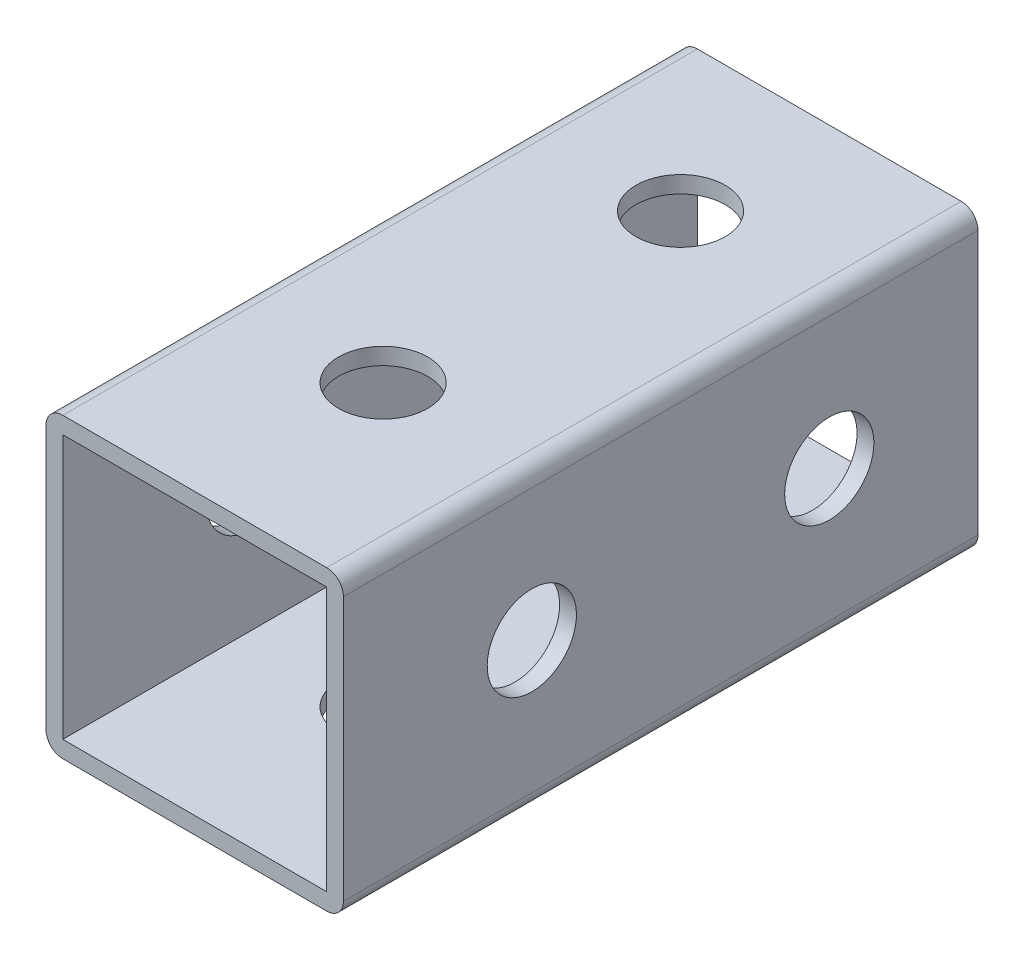
ISO-10303-21;
HEADER;
FILE_DESCRIPTION(('STEP AP214'),'2;1');
FILE_NAME('part.step','',(''),(''),'','','');
FILE_SCHEMA(('AUTOMOTIVE_DESIGN { 1 0 10303 214 1 1 1 1 }'));
ENDSEC;
DATA;
#1=APPLICATION_CONTEXT('core data for automotive mechanical design processes');
#2=APPLICATION_PROTOCOL_DEFINITION('international standard','automotive_design',2000,#1);
#3=PRODUCT_CONTEXT('',#1,'mechanical');
#4=PRODUCT('Part','Part','',(#3));
#5=PRODUCT_RELATED_PRODUCT_CATEGORY('part','',(#4));
#6=PRODUCT_DEFINITION_FORMATION('','',#4);
#7=PRODUCT_DEFINITION_CONTEXT('part definition',#1,'design');
#8=PRODUCT_DEFINITION('design','',#6,#7);
#9=PRODUCT_DEFINITION_SHAPE('','',#8);
#10=(LENGTH_UNIT() NAMED_UNIT(*) SI_UNIT(.MILLI.,.METRE.));
#11=(NAMED_UNIT(*) PLANE_ANGLE_UNIT() SI_UNIT($,.RADIAN.));
#12=(NAMED_UNIT(*) SI_UNIT($,.STERADIAN.) SOLID_ANGLE_UNIT());
#13=UNCERTAINTY_MEASURE_WITH_UNIT(LENGTH_MEASURE(1.E-05),#10,'distance_accuracy_value','');
#14=(GEOMETRIC_REPRESENTATION_CONTEXT(3) GLOBAL_UNCERTAINTY_ASSIGNED_CONTEXT((#13)) GLOBAL_UNIT_ASSIGNED_CONTEXT((#10,
#11,#12)) REPRESENTATION_CONTEXT('',''));
#15=CARTESIAN_POINT('',(0.,0.,0.));
#16=DIRECTION('',(0.,0.,1.));
#17=DIRECTION('',(1.,0.,0.));
#18=AXIS2_PLACEMENT_3D('',#15,#16,#17);
#19=CARTESIAN_POINT('',(21.1201,21.1201,101.6));
#20=DIRECTION('',(0.,0.,-1.));
#21=DIRECTION('',(-1.,0.,0.));
#22=AXIS2_PLACEMENT_3D('',#19,#20,#21);
#23=PLANE('',#22);
#24=CARTESIAN_POINT('',(21.1201,21.1201,101.6));
#25=DIRECTION('',(0.,0.,1.));
#26=DIRECTION('',(-1.,0.,0.));
#27=AXIS2_PLACEMENT_3D('',#24,#25,#26);
#28=CIRCLE('',#27,2.6924);
#29=CARTESIAN_POINT('',(23.8125,21.1201,101.6));
#30=VERTEX_POINT('',#29);
#31=CARTESIAN_POINT('',(21.1201,23.8125,101.6));
#32=VERTEX_POINT('',#31);
#33=EDGE_CURVE('E161',#30,#32,#28,.T.);
#34=ORIENTED_EDGE('',*,*,#33,.T.);
#35=DIRECTION('',(-1.,0.,0.));
#36=VECTOR('',#35,1.);
#37=CARTESIAN_POINT('',(-21.1201,23.8125,101.6));
#38=LINE('',#37,#36);
#39=CARTESIAN_POINT('',(-21.1201,23.8125,101.6));
#40=VERTEX_POINT('',#39);
#41=EDGE_CURVE('E164',#32,#40,#38,.T.);
#42=ORIENTED_EDGE('',*,*,#41,.T.);
#43=CARTESIAN_POINT('',(-21.1201,21.1201,101.6));
#44=DIRECTION('',(0.,0.,1.));
#45=DIRECTION('',(1.,0.,0.));
#46=AXIS2_PLACEMENT_3D('',#43,#44,#45);
#47=CIRCLE('',#46,2.69240000000001);
#48=CARTESIAN_POINT('',(-23.8125,21.1201,101.6));
#49=VERTEX_POINT('',#48);
#50=EDGE_CURVE('E167',#40,#49,#47,.T.);
#51=ORIENTED_EDGE('',*,*,#50,.T.);
#52=DIRECTION('',(0.,-1.,0.));
#53=VECTOR('',#52,1.);
#54=CARTESIAN_POINT('',(-23.8125,21.1201,101.6));
#55=LINE('',#54,#53);
#56=CARTESIAN_POINT('',(-23.8125,-21.1201,101.6));
#57=VERTEX_POINT('',#56);
#58=EDGE_CURVE('E169',#49,#57,#55,.T.);
#59=ORIENTED_EDGE('',*,*,#58,.T.);
#60=CARTESIAN_POINT('',(-21.1201,-21.1201,101.6));
#61=DIRECTION('',(0.,0.,1.));
#62=DIRECTION('',(-1.,0.,0.));
#63=AXIS2_PLACEMENT_3D('',#60,#61,#62);
#64=CIRCLE('',#63,2.69240000000001);
#65=CARTESIAN_POINT('',(-21.1201,-23.8125,101.6));
#66=VERTEX_POINT('',#65);
#67=EDGE_CURVE('E171',#57,#66,#64,.T.);
#68=ORIENTED_EDGE('',*,*,#67,.T.);
#69=DIRECTION('',(1.,0.,0.));
#70=VECTOR('',#69,1.);
#71=CARTESIAN_POINT('',(-21.1201,-23.8125,101.6));
#72=LINE('',#71,#70);
#73=CARTESIAN_POINT('',(21.1201,-23.8125,101.6));
#74=VERTEX_POINT('',#73);
#75=EDGE_CURVE('E173',#66,#74,#72,.T.);
#76=ORIENTED_EDGE('',*,*,#75,.T.);
#77=CARTESIAN_POINT('',(21.1201,-21.1201,101.6));
#78=DIRECTION('',(0.,0.,1.));
#79=DIRECTION('',(1.,0.,0.));
#80=AXIS2_PLACEMENT_3D('',#77,#78,#79);
#81=CIRCLE('',#80,2.6924);
#82=CARTESIAN_POINT('',(23.8125,-21.1201,101.6));
#83=VERTEX_POINT('',#82);
#84=EDGE_CURVE('E175',#74,#83,#81,.T.);
#85=ORIENTED_EDGE('',*,*,#84,.T.);
#86=DIRECTION('',(0.,1.,0.));
#87=VECTOR('',#86,1.);
#88=CARTESIAN_POINT('',(23.8125,-21.1201,101.6));
#89=LINE('',#88,#87);
#90=EDGE_CURVE('E177',#83,#30,#89,.T.);
#91=ORIENTED_EDGE('',*,*,#90,.T.);
#92=EDGE_LOOP('',(#34,#42,#51,#59,#68,#76,#85,#91));
#93=FACE_BOUND('',#92,.T.);
#94=DIRECTION('',(0.,1.,0.));
#95=VECTOR('',#94,1.);
#96=CARTESIAN_POINT('',(21.1201,-21.1201,101.6));
#97=LINE('',#96,#95);
#98=CARTESIAN_POINT('',(21.1201,-21.1201,101.6));
#99=VERTEX_POINT('',#98);
#100=CARTESIAN_POINT('',(21.1201,21.1201,101.6));
#101=VERTEX_POINT('',#100);
#102=EDGE_CURVE('E123',#99,#101,#97,.T.);
#103=ORIENTED_EDGE('',*,*,#102,.F.);
#104=DIRECTION('',(1.,0.,0.));
#105=VECTOR('',#104,1.);
#106=CARTESIAN_POINT('',(-21.1201,-21.1201,101.6));
#107=LINE('',#106,#105);
#108=CARTESIAN_POINT('',(-21.1201,-21.1201,101.6));
#109=VERTEX_POINT('',#108);
#110=EDGE_CURVE('E145',#109,#99,#107,.T.);
#111=ORIENTED_EDGE('',*,*,#110,.F.);
#112=DIRECTION('',(0.,-1.,0.));
#113=VECTOR('',#112,1.);
#114=CARTESIAN_POINT('',(-21.1201,21.1201,101.6));
#115=LINE('',#114,#113);
#116=CARTESIAN_POINT('',(-21.1201,21.1201,101.6));
#117=VERTEX_POINT('',#116);
#118=EDGE_CURVE('E143',#117,#109,#115,.T.);
#119=ORIENTED_EDGE('',*,*,#118,.F.);
#120=DIRECTION('',(-1.,0.,0.));
#121=VECTOR('',#120,1.);
#122=CARTESIAN_POINT('',(-21.1201,21.1201,101.6));
#123=LINE('',#122,#121);
#124=EDGE_CURVE('E131',#101,#117,#123,.T.);
#125=ORIENTED_EDGE('',*,*,#124,.F.);
#126=EDGE_LOOP('',(#103,#111,#119,#125));
#127=FACE_BOUND('',#126,.T.);
#128=ADVANCED_FACE('F32',(#93,#127),#23,.F.);
#129=CARTESIAN_POINT('',(21.1201,21.1201,0.));
#130=DIRECTION('',(0.,0.,-1.));
#131=DIRECTION('',(-1.,0.,0.));
#132=AXIS2_PLACEMENT_3D('',#129,#130,#131);
#133=PLANE('',#132);
#134=CARTESIAN_POINT('',(21.1201,21.1201,0.));
#135=DIRECTION('',(0.,0.,1.));
#136=DIRECTION('',(-1.,0.,0.));
#137=AXIS2_PLACEMENT_3D('',#134,#135,#136);
#138=CIRCLE('',#137,2.6924);
#139=CARTESIAN_POINT('',(23.8125,21.1201,0.));
#140=VERTEX_POINT('',#139);
#141=CARTESIAN_POINT('',(21.1201,23.8125,0.));
#142=VERTEX_POINT('',#141);
#143=EDGE_CURVE('E139',#140,#142,#138,.T.);
#144=ORIENTED_EDGE('',*,*,#143,.F.);
#145=DIRECTION('',(0.,1.,0.));
#146=VECTOR('',#145,1.);
#147=CARTESIAN_POINT('',(23.8125,-21.1201,0.));
#148=LINE('',#147,#146);
#149=CARTESIAN_POINT('',(23.8125,-21.1201,0.));
#150=VERTEX_POINT('',#149);
#151=EDGE_CURVE('E165',#150,#140,#148,.T.);
#152=ORIENTED_EDGE('',*,*,#151,.F.);
#153=CARTESIAN_POINT('',(21.1201,-21.1201,0.));
#154=DIRECTION('',(0.,0.,1.));
#155=DIRECTION('',(1.,0.,0.));
#156=AXIS2_PLACEMENT_3D('',#153,#154,#155);
#157=CIRCLE('',#156,2.6924);
#158=CARTESIAN_POINT('',(21.1201,-23.8125,0.));
#159=VERTEX_POINT('',#158);
#160=EDGE_CURVE('E192',#159,#150,#157,.T.);
#161=ORIENTED_EDGE('',*,*,#160,.F.);
#162=DIRECTION('',(1.,0.,0.));
#163=VECTOR('',#162,1.);
#164=CARTESIAN_POINT('',(-21.1201,-23.8125,0.));
#165=LINE('',#164,#163);
#166=CARTESIAN_POINT('',(-21.1201,-23.8125,0.));
#167=VERTEX_POINT('',#166);
#168=EDGE_CURVE('E190',#167,#159,#165,.T.);
#169=ORIENTED_EDGE('',*,*,#168,.F.);
#170=CARTESIAN_POINT('',(-21.1201,-21.1201,0.));
#171=DIRECTION('',(0.,0.,1.));
#172=DIRECTION('',(-1.,0.,0.));
#173=AXIS2_PLACEMENT_3D('',#170,#171,#172);
#174=CIRCLE('',#173,2.69240000000001);
#175=CARTESIAN_POINT('',(-23.8125,-21.1201,0.));
#176=VERTEX_POINT('',#175);
#177=EDGE_CURVE('E188',#176,#167,#174,.T.);
#178=ORIENTED_EDGE('',*,*,#177,.F.);
#179=DIRECTION('',(0.,-1.,0.));
#180=VECTOR('',#179,1.);
#181=CARTESIAN_POINT('',(-23.8125,21.1201,0.));
#182=LINE('',#181,#180);
#183=CARTESIAN_POINT('',(-23.8125,21.1201,0.));
#184=VERTEX_POINT('',#183);
#185=EDGE_CURVE('E186',#184,#176,#182,.T.);
#186=ORIENTED_EDGE('',*,*,#185,.F.);
#187=CARTESIAN_POINT('',(-21.1201,21.1201,0.));
#188=DIRECTION('',(0.,0.,1.));
#189=DIRECTION('',(1.,0.,0.));
#190=AXIS2_PLACEMENT_3D('',#187,#188,#189);
#191=CIRCLE('',#190,2.69240000000001);
#192=CARTESIAN_POINT('',(-21.1201,23.8125,0.));
#193=VERTEX_POINT('',#192);
#194=EDGE_CURVE('E184',#193,#184,#191,.T.);
#195=ORIENTED_EDGE('',*,*,#194,.F.);
#196=DIRECTION('',(-1.,0.,0.));
#197=VECTOR('',#196,1.);
#198=CARTESIAN_POINT('',(-21.1201,23.8125,0.));
#199=LINE('',#198,#197);
#200=EDGE_CURVE('E182',#142,#193,#199,.T.);
#201=ORIENTED_EDGE('',*,*,#200,.F.);
#202=EDGE_LOOP('',(#144,#152,#161,#169,#178,#186,#195,#201));
#203=FACE_BOUND('',#202,.T.);
#204=DIRECTION('',(1.,0.,0.));
#205=VECTOR('',#204,1.);
#206=CARTESIAN_POINT('',(-21.1201,-21.1201,0.));
#207=LINE('',#206,#205);
#208=CARTESIAN_POINT('',(-21.1201,-21.1201,0.));
#209=VERTEX_POINT('',#208);
#210=CARTESIAN_POINT('',(21.1201,-21.1201,0.));
#211=VERTEX_POINT('',#210);
#212=EDGE_CURVE('E132',#209,#211,#207,.T.);
#213=ORIENTED_EDGE('',*,*,#212,.T.);
#214=DIRECTION('',(0.,1.,0.));
#215=VECTOR('',#214,1.);
#216=CARTESIAN_POINT('',(21.1201,-21.1201,0.));
#217=LINE('',#216,#215);
#218=CARTESIAN_POINT('',(21.1201,21.1201,0.));
#219=VERTEX_POINT('',#218);
#220=EDGE_CURVE('E57',#211,#219,#217,.T.);
#221=ORIENTED_EDGE('',*,*,#220,.T.);
#222=DIRECTION('',(-1.,0.,0.));
#223=VECTOR('',#222,1.);
#224=CARTESIAN_POINT('',(-21.1201,21.1201,0.));
#225=LINE('',#224,#223);
#226=CARTESIAN_POINT('',(-21.1201,21.1201,0.));
#227=VERTEX_POINT('',#226);
#228=EDGE_CURVE('E138',#219,#227,#225,.T.);
#229=ORIENTED_EDGE('',*,*,#228,.T.);
#230=DIRECTION('',(0.,-1.,0.));
#231=VECTOR('',#230,1.);
#232=CARTESIAN_POINT('',(-21.1201,21.1201,0.));
#233=LINE('',#232,#231);
#234=EDGE_CURVE('E153',#227,#209,#233,.T.);
#235=ORIENTED_EDGE('',*,*,#234,.T.);
#236=EDGE_LOOP('',(#213,#221,#229,#235));
#237=FACE_BOUND('',#236,.T.);
#238=ADVANCED_FACE('F281',(#203,#237),#133,.T.);
#239=CARTESIAN_POINT('',(21.1201,21.1201,101.6));
#240=DIRECTION('',(0.,0.,-1.));
#241=DIRECTION('',(-1.,0.,0.));
#242=AXIS2_PLACEMENT_3D('',#239,#240,#241);
#243=CYLINDRICAL_SURFACE('',#242,2.6924);
#244=ORIENTED_EDGE('',*,*,#143,.T.);
#245=DIRECTION('',(0.,0.,-1.));
#246=VECTOR('',#245,1.);
#247=CARTESIAN_POINT('',(21.1201,23.8125,101.6));
#248=LINE('',#247,#246);
#249=EDGE_CURVE('E11',#32,#142,#248,.T.);
#250=ORIENTED_EDGE('',*,*,#249,.F.);
#251=ORIENTED_EDGE('',*,*,#33,.F.);
#252=DIRECTION('',(0.,0.,-1.));
#253=VECTOR('',#252,1.);
#254=CARTESIAN_POINT('',(23.8125,21.1201,101.6));
#255=LINE('',#254,#253);
#256=EDGE_CURVE('E179',#30,#140,#255,.T.);
#257=ORIENTED_EDGE('',*,*,#256,.T.);
#258=EDGE_LOOP('',(#244,#250,#251,#257));
#259=FACE_BOUND('',#258,.T.);
#260=ADVANCED_FACE('F34',(#259),#243,.T.);
#261=CARTESIAN_POINT('',(-21.1201,23.8125,101.6));
#262=DIRECTION('',(0.,-1.,0.));
#263=DIRECTION('',(1.,0.,0.));
#264=AXIS2_PLACEMENT_3D('',#261,#262,#263);
#265=PLANE('',#264);
#266=CARTESIAN_POINT('',(0.,23.8125,71.4375));
#267=DIRECTION('',(0.,1.,0.));
#268=DIRECTION('',(-1.,0.,0.));
#269=AXIS2_PLACEMENT_3D('',#266,#267,#268);
#270=CIRCLE('',#269,7.14375);
#271=CARTESIAN_POINT('',(-7.14375,23.8125,71.4375));
#272=VERTEX_POINT('',#271);
#273=EDGE_CURVE('E233',#272,#272,#270,.T.);
#274=ORIENTED_EDGE('',*,*,#273,.F.);
#275=EDGE_LOOP('',(#274));
#276=FACE_BOUND('',#275,.T.);
#277=CARTESIAN_POINT('',(0.,23.8125,23.8125));
#278=DIRECTION('',(0.,1.,0.));
#279=DIRECTION('',(-1.,0.,0.));
#280=AXIS2_PLACEMENT_3D('',#277,#278,#279);
#281=CIRCLE('',#280,7.14375);
#282=CARTESIAN_POINT('',(-7.14375,23.8125,23.8125));
#283=VERTEX_POINT('',#282);
#284=EDGE_CURVE('E255',#283,#283,#281,.T.);
#285=ORIENTED_EDGE('',*,*,#284,.F.);
#286=EDGE_LOOP('',(#285));
#287=FACE_BOUND('',#286,.T.);
#288=ORIENTED_EDGE('',*,*,#200,.T.);
#289=DIRECTION('',(0.,0.,-1.));
#290=VECTOR('',#289,1.);
#291=CARTESIAN_POINT('',(-21.1201,23.8125,101.6));
#292=LINE('',#291,#290);
#293=EDGE_CURVE('E41',#40,#193,#292,.T.);
#294=ORIENTED_EDGE('',*,*,#293,.F.);
#295=ORIENTED_EDGE('',*,*,#41,.F.);
#296=ORIENTED_EDGE('',*,*,#249,.T.);
#297=EDGE_LOOP('',(#288,#294,#295,#296));
#298=FACE_BOUND('',#297,.T.);
#299=ADVANCED_FACE('F310',(#276,#287,#298),#265,.F.);
#300=CARTESIAN_POINT('',(-21.1201,21.1201,101.6));
#301=DIRECTION('',(0.,0.,-1.));
#302=DIRECTION('',(-1.,0.,0.));
#303=AXIS2_PLACEMENT_3D('',#300,#301,#302);
#304=CYLINDRICAL_SURFACE('',#303,2.69240000000001);
#305=ORIENTED_EDGE('',*,*,#194,.T.);
#306=DIRECTION('',(0.,0.,-1.));
#307=VECTOR('',#306,1.);
#308=CARTESIAN_POINT('',(-23.8125,21.1201,101.6));
#309=LINE('',#308,#307);
#310=EDGE_CURVE('E209',#49,#184,#309,.T.);
#311=ORIENTED_EDGE('',*,*,#310,.F.);
#312=ORIENTED_EDGE('',*,*,#50,.F.);
#313=ORIENTED_EDGE('',*,*,#293,.T.);
#314=EDGE_LOOP('',(#305,#311,#312,#313));
#315=FACE_BOUND('',#314,.T.);
#316=ADVANCED_FACE('F307',(#315),#304,.T.);
#317=CARTESIAN_POINT('',(-23.8125,21.1201,101.6));
#318=DIRECTION('',(1.,0.,0.));
#319=DIRECTION('',(0.,0.,-1.));
#320=AXIS2_PLACEMENT_3D('',#317,#318,#319);
#321=PLANE('',#320);
#322=CARTESIAN_POINT('',(-23.8125,0.,71.4375));
#323=DIRECTION('',(-1.,0.,0.));
#324=DIRECTION('',(0.,-1.,0.));
#325=AXIS2_PLACEMENT_3D('',#322,#323,#324);
#326=CIRCLE('',#325,7.14375);
#327=CARTESIAN_POINT('',(-23.8125,-7.14375000000008,71.4375));
#328=VERTEX_POINT('',#327);
#329=EDGE_CURVE('E235',#328,#328,#326,.T.);
#330=ORIENTED_EDGE('',*,*,#329,.F.);
#331=EDGE_LOOP('',(#330));
#332=FACE_BOUND('',#331,.T.);
#333=CARTESIAN_POINT('',(-23.8125,0.,23.8125));
#334=DIRECTION('',(-1.,0.,0.));
#335=DIRECTION('',(0.,-1.,0.));
#336=AXIS2_PLACEMENT_3D('',#333,#334,#335);
#337=CIRCLE('',#336,7.14375);
#338=CARTESIAN_POINT('',(-23.8125,-7.14375000000008,23.8125));
#339=VERTEX_POINT('',#338);
#340=EDGE_CURVE('E248',#339,#339,#337,.T.);
#341=ORIENTED_EDGE('',*,*,#340,.F.);
#342=EDGE_LOOP('',(#341));
#343=FACE_BOUND('',#342,.T.);
#344=ORIENTED_EDGE('',*,*,#185,.T.);
#345=DIRECTION('',(0.,0.,-1.));
#346=VECTOR('',#345,1.);
#347=CARTESIAN_POINT('',(-23.8125,-21.1201,101.6));
#348=LINE('',#347,#346);
#349=EDGE_CURVE('E206',#57,#176,#348,.T.);
#350=ORIENTED_EDGE('',*,*,#349,.F.);
#351=ORIENTED_EDGE('',*,*,#58,.F.);
#352=ORIENTED_EDGE('',*,*,#310,.T.);
#353=EDGE_LOOP('',(#344,#350,#351,#352));
#354=FACE_BOUND('',#353,.T.);
#355=ADVANCED_FACE('F303',(#332,#343,#354),#321,.F.);
#356=CARTESIAN_POINT('',(-21.1201,-21.1201,101.6));
#357=DIRECTION('',(0.,0.,-1.));
#358=DIRECTION('',(-1.,0.,0.));
#359=AXIS2_PLACEMENT_3D('',#356,#357,#358);
#360=CYLINDRICAL_SURFACE('',#359,2.69240000000001);
#361=ORIENTED_EDGE('',*,*,#177,.T.);
#362=DIRECTION('',(0.,0.,-1.));
#363=VECTOR('',#362,1.);
#364=CARTESIAN_POINT('',(-21.1201,-23.8125,101.6));
#365=LINE('',#364,#363);
#366=EDGE_CURVE('E203',#66,#167,#365,.T.);
#367=ORIENTED_EDGE('',*,*,#366,.F.);
#368=ORIENTED_EDGE('',*,*,#67,.F.);
#369=ORIENTED_EDGE('',*,*,#349,.T.);
#370=EDGE_LOOP('',(#361,#367,#368,#369));
#371=FACE_BOUND('',#370,.T.);
#372=ADVANCED_FACE('F299',(#371),#360,.T.);
#373=CARTESIAN_POINT('',(-21.1201,-23.8125,101.6));
#374=DIRECTION('',(0.,1.,0.));
#375=DIRECTION('',(-1.,0.,0.));
#376=AXIS2_PLACEMENT_3D('',#373,#374,#375);
#377=PLANE('',#376);
#378=CARTESIAN_POINT('',(0.,-23.8125,71.4375));
#379=DIRECTION('',(0.,1.,0.));
#380=DIRECTION('',(-1.,0.,0.));
#381=AXIS2_PLACEMENT_3D('',#378,#379,#380);
#382=CIRCLE('',#381,7.14375);
#383=CARTESIAN_POINT('',(-7.14375,-23.8125,71.4375));
#384=VERTEX_POINT('',#383);
#385=EDGE_CURVE('E226',#384,#384,#382,.T.);
#386=ORIENTED_EDGE('',*,*,#385,.T.);
#387=EDGE_LOOP('',(#386));
#388=FACE_BOUND('',#387,.T.);
#389=CARTESIAN_POINT('',(0.,-23.8125,23.8125));
#390=DIRECTION('',(0.,1.,0.));
#391=DIRECTION('',(-1.,0.,0.));
#392=AXIS2_PLACEMENT_3D('',#389,#390,#391);
#393=CIRCLE('',#392,7.14375);
#394=CARTESIAN_POINT('',(-7.14375,-23.8125,23.8125));
#395=VERTEX_POINT('',#394);
#396=EDGE_CURVE('E217',#395,#395,#393,.T.);
#397=ORIENTED_EDGE('',*,*,#396,.T.);
#398=EDGE_LOOP('',(#397));
#399=FACE_BOUND('',#398,.T.);
#400=ORIENTED_EDGE('',*,*,#168,.T.);
#401=DIRECTION('',(0.,0.,-1.));
#402=VECTOR('',#401,1.);
#403=CARTESIAN_POINT('',(21.1201,-23.8125,101.6));
#404=LINE('',#403,#402);
#405=EDGE_CURVE('E200',#74,#159,#404,.T.);
#406=ORIENTED_EDGE('',*,*,#405,.F.);
#407=ORIENTED_EDGE('',*,*,#75,.F.);
#408=ORIENTED_EDGE('',*,*,#366,.T.);
#409=EDGE_LOOP('',(#400,#406,#407,#408));
#410=FACE_BOUND('',#409,.T.);
#411=ADVANCED_FACE('F295',(#388,#399,#410),#377,.F.);
#412=CARTESIAN_POINT('',(21.1201,-21.1201,101.6));
#413=DIRECTION('',(0.,0.,-1.));
#414=DIRECTION('',(-1.,0.,0.));
#415=AXIS2_PLACEMENT_3D('',#412,#413,#414);
#416=CYLINDRICAL_SURFACE('',#415,2.6924);
#417=ORIENTED_EDGE('',*,*,#160,.T.);
#418=DIRECTION('',(0.,0.,-1.));
#419=VECTOR('',#418,1.);
#420=CARTESIAN_POINT('',(23.8125,-21.1201,101.6));
#421=LINE('',#420,#419);
#422=EDGE_CURVE('E197',#83,#150,#421,.T.);
#423=ORIENTED_EDGE('',*,*,#422,.F.);
#424=ORIENTED_EDGE('',*,*,#84,.F.);
#425=ORIENTED_EDGE('',*,*,#405,.T.);
#426=EDGE_LOOP('',(#417,#423,#424,#425));
#427=FACE_BOUND('',#426,.T.);
#428=ADVANCED_FACE('F292',(#427),#416,.T.);
#429=CARTESIAN_POINT('',(23.8125,-21.1201,101.6));
#430=DIRECTION('',(-1.,0.,0.));
#431=DIRECTION('',(0.,0.,1.));
#432=AXIS2_PLACEMENT_3D('',#429,#430,#431);
#433=PLANE('',#432);
#434=CARTESIAN_POINT('',(23.8125000000002,0.,71.4375));
#435=DIRECTION('',(-1.,0.,0.));
#436=DIRECTION('',(0.,-1.,0.));
#437=AXIS2_PLACEMENT_3D('',#434,#435,#436);
#438=CIRCLE('',#437,7.14375);
#439=CARTESIAN_POINT('',(23.8125000000002,-7.14374999999992,71.4375));
#440=VERTEX_POINT('',#439);
#441=EDGE_CURVE('E229',#440,#440,#438,.T.);
#442=ORIENTED_EDGE('',*,*,#441,.T.);
#443=EDGE_LOOP('',(#442));
#444=FACE_BOUND('',#443,.T.);
#445=CARTESIAN_POINT('',(23.8125000000001,0.,23.8125));
#446=DIRECTION('',(-1.,0.,0.));
#447=DIRECTION('',(0.,-1.,0.));
#448=AXIS2_PLACEMENT_3D('',#445,#446,#447);
#449=CIRCLE('',#448,7.14375);
#450=CARTESIAN_POINT('',(23.8125000000001,-7.14374999999992,23.8125));
#451=VERTEX_POINT('',#450);
#452=EDGE_CURVE('E222',#451,#451,#449,.T.);
#453=ORIENTED_EDGE('',*,*,#452,.T.);
#454=EDGE_LOOP('',(#453));
#455=FACE_BOUND('',#454,.T.);
#456=ORIENTED_EDGE('',*,*,#151,.T.);
#457=ORIENTED_EDGE('',*,*,#256,.F.);
#458=ORIENTED_EDGE('',*,*,#90,.F.);
#459=ORIENTED_EDGE('',*,*,#422,.T.);
#460=EDGE_LOOP('',(#456,#457,#458,#459));
#461=FACE_BOUND('',#460,.T.);
#462=ADVANCED_FACE('F276',(#444,#455,#461),#433,.F.);
#463=CARTESIAN_POINT('',(21.1201,-21.1201,101.6));
#464=DIRECTION('',(-1.,0.,0.));
#465=DIRECTION('',(0.,0.,1.));
#466=AXIS2_PLACEMENT_3D('',#463,#464,#465);
#467=PLANE('',#466);
#468=CARTESIAN_POINT('',(21.1201,0.,71.4375));
#469=DIRECTION('',(-1.,0.,0.));
#470=DIRECTION('',(0.,0.,1.));
#471=AXIS2_PLACEMENT_3D('',#468,#469,#470);
#472=CIRCLE('',#471,7.14375);
#473=CARTESIAN_POINT('',(21.1201,-7.14374999999993,71.4375));
#474=VERTEX_POINT('',#473);
#475=EDGE_CURVE('E36',#474,#474,#472,.T.);
#476=ORIENTED_EDGE('',*,*,#475,.F.);
#477=EDGE_LOOP('',(#476));
#478=FACE_BOUND('',#477,.T.);
#479=CARTESIAN_POINT('',(21.1201,0.,23.8125));
#480=DIRECTION('',(-1.,0.,0.));
#481=DIRECTION('',(0.,0.,1.));
#482=AXIS2_PLACEMENT_3D('',#479,#480,#481);
#483=CIRCLE('',#482,7.14375);
#484=CARTESIAN_POINT('',(21.1201,0.,30.95625));
#485=VERTEX_POINT('',#484);
#486=EDGE_CURVE('E221',#485,#485,#483,.T.);
#487=ORIENTED_EDGE('',*,*,#486,.F.);
#488=EDGE_LOOP('',(#487));
#489=FACE_BOUND('',#488,.T.);
#490=ORIENTED_EDGE('',*,*,#220,.F.);
#491=DIRECTION('',(0.,0.,-1.));
#492=VECTOR('',#491,1.);
#493=CARTESIAN_POINT('',(21.1201,-21.1201,101.6));
#494=LINE('',#493,#492);
#495=EDGE_CURVE('E127',#99,#211,#494,.T.);
#496=ORIENTED_EDGE('',*,*,#495,.F.);
#497=ORIENTED_EDGE('',*,*,#102,.T.);
#498=DIRECTION('',(0.,0.,-1.));
#499=VECTOR('',#498,1.);
#500=CARTESIAN_POINT('',(21.1201,21.1201,101.6));
#501=LINE('',#500,#499);
#502=EDGE_CURVE('E126',#101,#219,#501,.T.);
#503=ORIENTED_EDGE('',*,*,#502,.T.);
#504=EDGE_LOOP('',(#490,#496,#497,#503));
#505=FACE_BOUND('',#504,.T.);
#506=ADVANCED_FACE('F125',(#478,#489,#505),#467,.T.);
#507=CARTESIAN_POINT('',(-21.1201,21.1201,101.6));
#508=DIRECTION('',(0.,-1.,0.));
#509=DIRECTION('',(1.,0.,0.));
#510=AXIS2_PLACEMENT_3D('',#507,#508,#509);
#511=PLANE('',#510);
#512=CARTESIAN_POINT('',(0.,21.1201,71.4375));
#513=DIRECTION('',(0.,-1.,0.));
#514=DIRECTION('',(1.,0.,0.));
#515=AXIS2_PLACEMENT_3D('',#512,#513,#514);
#516=CIRCLE('',#515,7.14375);
#517=CARTESIAN_POINT('',(7.14375,21.1201,71.4375));
#518=VERTEX_POINT('',#517);
#519=EDGE_CURVE('E225',#518,#518,#516,.T.);
#520=ORIENTED_EDGE('',*,*,#519,.F.);
#521=EDGE_LOOP('',(#520));
#522=FACE_BOUND('',#521,.T.);
#523=CARTESIAN_POINT('',(0.,21.1201,23.8125));
#524=DIRECTION('',(0.,-1.,0.));
#525=DIRECTION('',(1.,0.,0.));
#526=AXIS2_PLACEMENT_3D('',#523,#524,#525);
#527=CIRCLE('',#526,7.14375);
#528=CARTESIAN_POINT('',(7.14375,21.1201,23.8125));
#529=VERTEX_POINT('',#528);
#530=EDGE_CURVE('E151',#529,#529,#527,.T.);
#531=ORIENTED_EDGE('',*,*,#530,.F.);
#532=EDGE_LOOP('',(#531));
#533=FACE_BOUND('',#532,.T.);
#534=ORIENTED_EDGE('',*,*,#228,.F.);
#535=ORIENTED_EDGE('',*,*,#502,.F.);
#536=ORIENTED_EDGE('',*,*,#124,.T.);
#537=DIRECTION('',(0.,0.,-1.));
#538=VECTOR('',#537,1.);
#539=CARTESIAN_POINT('',(-21.1201,21.1201,101.6));
#540=LINE('',#539,#538);
#541=EDGE_CURVE('E140',#117,#227,#540,.T.);
#542=ORIENTED_EDGE('',*,*,#541,.T.);
#543=EDGE_LOOP('',(#534,#535,#536,#542));
#544=FACE_BOUND('',#543,.T.);
#545=ADVANCED_FACE('F135',(#522,#533,#544),#511,.T.);
#546=CARTESIAN_POINT('',(-21.1201,21.1201,101.6));
#547=DIRECTION('',(1.,0.,0.));
#548=DIRECTION('',(0.,0.,-1.));
#549=AXIS2_PLACEMENT_3D('',#546,#547,#548);
#550=PLANE('',#549);
#551=CARTESIAN_POINT('',(-21.1201,0.,71.4375));
#552=DIRECTION('',(1.,0.,0.));
#553=DIRECTION('',(0.,0.,-1.));
#554=AXIS2_PLACEMENT_3D('',#551,#552,#553);
#555=CIRCLE('',#554,7.14375);
#556=CARTESIAN_POINT('',(-21.1201,-7.14375000000007,71.4375));
#557=VERTEX_POINT('',#556);
#558=EDGE_CURVE('E227',#557,#557,#555,.T.);
#559=ORIENTED_EDGE('',*,*,#558,.F.);
#560=EDGE_LOOP('',(#559));
#561=FACE_BOUND('',#560,.T.);
#562=CARTESIAN_POINT('',(-21.1201,0.,23.8125));
#563=DIRECTION('',(1.,0.,0.));
#564=DIRECTION('',(0.,0.,-1.));
#565=AXIS2_PLACEMENT_3D('',#562,#563,#564);
#566=CIRCLE('',#565,7.14375);
#567=CARTESIAN_POINT('',(-21.1201,0.,16.66875));
#568=VERTEX_POINT('',#567);
#569=EDGE_CURVE('E218',#568,#568,#566,.T.);
#570=ORIENTED_EDGE('',*,*,#569,.F.);
#571=EDGE_LOOP('',(#570));
#572=FACE_BOUND('',#571,.T.);
#573=ORIENTED_EDGE('',*,*,#234,.F.);
#574=ORIENTED_EDGE('',*,*,#541,.F.);
#575=ORIENTED_EDGE('',*,*,#118,.T.);
#576=DIRECTION('',(0.,0.,-1.));
#577=VECTOR('',#576,1.);
#578=CARTESIAN_POINT('',(-21.1201,-21.1201,101.6));
#579=LINE('',#578,#577);
#580=EDGE_CURVE('E49',#109,#209,#579,.T.);
#581=ORIENTED_EDGE('',*,*,#580,.T.);
#582=EDGE_LOOP('',(#573,#574,#575,#581));
#583=FACE_BOUND('',#582,.T.);
#584=ADVANCED_FACE('F266',(#561,#572,#583),#550,.T.);
#585=CARTESIAN_POINT('',(-21.1201,-21.1201,101.6));
#586=DIRECTION('',(0.,1.,0.));
#587=DIRECTION('',(-1.,0.,0.));
#588=AXIS2_PLACEMENT_3D('',#585,#586,#587);
#589=PLANE('',#588);
#590=CARTESIAN_POINT('',(0.,-21.1201,71.4375));
#591=DIRECTION('',(0.,1.,0.));
#592=DIRECTION('',(-1.,0.,0.));
#593=AXIS2_PLACEMENT_3D('',#590,#591,#592);
#594=CIRCLE('',#593,7.14375);
#595=CARTESIAN_POINT('',(-7.14375,-21.1201,71.4375));
#596=VERTEX_POINT('',#595);
#597=EDGE_CURVE('E223',#596,#596,#594,.T.);
#598=ORIENTED_EDGE('',*,*,#597,.F.);
#599=EDGE_LOOP('',(#598));
#600=FACE_BOUND('',#599,.T.);
#601=CARTESIAN_POINT('',(0.,-21.1201,23.8125));
#602=DIRECTION('',(0.,1.,0.));
#603=DIRECTION('',(-1.,0.,0.));
#604=AXIS2_PLACEMENT_3D('',#601,#602,#603);
#605=CIRCLE('',#604,7.14375);
#606=CARTESIAN_POINT('',(-7.14375,-21.1201,23.8125));
#607=VERTEX_POINT('',#606);
#608=EDGE_CURVE('E214',#607,#607,#605,.T.);
#609=ORIENTED_EDGE('',*,*,#608,.F.);
#610=EDGE_LOOP('',(#609));
#611=FACE_BOUND('',#610,.T.);
#612=ORIENTED_EDGE('',*,*,#212,.F.);
#613=ORIENTED_EDGE('',*,*,#580,.F.);
#614=ORIENTED_EDGE('',*,*,#110,.T.);
#615=ORIENTED_EDGE('',*,*,#495,.T.);
#616=EDGE_LOOP('',(#612,#613,#614,#615));
#617=FACE_BOUND('',#616,.T.);
#618=ADVANCED_FACE('F273',(#600,#611,#617),#589,.T.);
#619=CARTESIAN_POINT('',(0.,-23.8125,23.8125));
#620=DIRECTION('',(0.,1.,0.));
#621=DIRECTION('',(-1.,0.,0.));
#622=AXIS2_PLACEMENT_3D('',#619,#620,#621);
#623=CYLINDRICAL_SURFACE('',#622,7.14375);
#624=ORIENTED_EDGE('',*,*,#608,.T.);
#625=EDGE_LOOP('',(#624));
#626=FACE_BOUND('',#625,.T.);
#627=ORIENTED_EDGE('',*,*,#396,.F.);
#628=EDGE_LOOP('',(#627));
#629=FACE_BOUND('',#628,.T.);
#630=ADVANCED_FACE('F350',(#626,#629),#623,.F.);
#631=ORIENTED_EDGE('',*,*,#530,.T.);
#632=EDGE_LOOP('',(#631));
#633=FACE_BOUND('',#632,.T.);
#634=ORIENTED_EDGE('',*,*,#284,.T.);
#635=EDGE_LOOP('',(#634));
#636=FACE_BOUND('',#635,.T.);
#637=ADVANCED_FACE('F262',(#633,#636),#623,.F.);
#638=CARTESIAN_POINT('',(23.8125000000001,0.,23.8125));
#639=DIRECTION('',(-1.,0.,0.));
#640=DIRECTION('',(0.,-1.,0.));
#641=AXIS2_PLACEMENT_3D('',#638,#639,#640);
#642=CYLINDRICAL_SURFACE('',#641,7.14375);
#643=ORIENTED_EDGE('',*,*,#569,.T.);
#644=EDGE_LOOP('',(#643));
#645=FACE_BOUND('',#644,.T.);
#646=ORIENTED_EDGE('',*,*,#340,.T.);
#647=EDGE_LOOP('',(#646));
#648=FACE_BOUND('',#647,.T.);
#649=ADVANCED_FACE('F361',(#645,#648),#642,.F.);
#650=ORIENTED_EDGE('',*,*,#486,.T.);
#651=EDGE_LOOP('',(#650));
#652=FACE_BOUND('',#651,.T.);
#653=ORIENTED_EDGE('',*,*,#452,.F.);
#654=EDGE_LOOP('',(#653));
#655=FACE_BOUND('',#654,.T.);
#656=ADVANCED_FACE('F364',(#652,#655),#642,.F.);
#657=CARTESIAN_POINT('',(0.,-23.8125,71.4375));
#658=DIRECTION('',(0.,1.,0.));
#659=DIRECTION('',(-1.,0.,0.));
#660=AXIS2_PLACEMENT_3D('',#657,#658,#659);
#661=CYLINDRICAL_SURFACE('',#660,7.14375);
#662=ORIENTED_EDGE('',*,*,#597,.T.);
#663=EDGE_LOOP('',(#662));
#664=FACE_BOUND('',#663,.T.);
#665=ORIENTED_EDGE('',*,*,#385,.F.);
#666=EDGE_LOOP('',(#665));
#667=FACE_BOUND('',#666,.T.);
#668=ADVANCED_FACE('F366',(#664,#667),#661,.F.);
#669=ORIENTED_EDGE('',*,*,#519,.T.);
#670=EDGE_LOOP('',(#669));
#671=FACE_BOUND('',#670,.T.);
#672=ORIENTED_EDGE('',*,*,#273,.T.);
#673=EDGE_LOOP('',(#672));
#674=FACE_BOUND('',#673,.T.);
#675=ADVANCED_FACE('F369',(#671,#674),#661,.F.);
#676=CARTESIAN_POINT('',(23.8125000000002,0.,71.4375));
#677=DIRECTION('',(-1.,0.,0.));
#678=DIRECTION('',(0.,-1.,0.));
#679=AXIS2_PLACEMENT_3D('',#676,#677,#678);
#680=CYLINDRICAL_SURFACE('',#679,7.14375);
#681=CARTESIAN_POINT('',(-21.1201,-7.14375000000007,71.4375));
#682=CARTESIAN_POINT('',(-21.1481458333333,-7.14375000000007,71.4375));
#683=CARTESIAN_POINT('',(-21.1761916666667,-7.14375000000007,71.4375));
#684=CARTESIAN_POINT('',(-21.2322833333333,-7.14375000000007,71.4375));
#685=CARTESIAN_POINT('',(-21.2603291666667,-7.14375000000007,71.4375));
#686=CARTESIAN_POINT('',(-21.3164208333333,-7.14375000000007,71.4375));
#687=CARTESIAN_POINT('',(-21.3444666666667,-7.14375000000007,71.4375));
#688=CARTESIAN_POINT('',(-21.4005583333333,-7.14375000000007,71.4375));
#689=CARTESIAN_POINT('',(-21.4286041666667,-7.14375000000007,71.4375));
#690=CARTESIAN_POINT('',(-21.4846958333333,-7.14375000000007,71.4375));
#691=CARTESIAN_POINT('',(-21.5127416666667,-7.14375000000007,71.4375));
#692=CARTESIAN_POINT('',(-21.5688333333333,-7.14375000000007,71.4375));
#693=CARTESIAN_POINT('',(-21.5968791666667,-7.14375000000008,71.4375));
#694=CARTESIAN_POINT('',(-21.6529708333333,-7.14375000000008,71.4375));
#695=CARTESIAN_POINT('',(-21.6810166666667,-7.14375000000008,71.4375));
#696=CARTESIAN_POINT('',(-21.7371083333333,-7.14375000000008,71.4375));
#697=CARTESIAN_POINT('',(-21.7651541666667,-7.14375000000008,71.4375));
#698=CARTESIAN_POINT('',(-21.8212458333333,-7.14375000000008,71.4375));
#699=CARTESIAN_POINT('',(-21.8492916666667,-7.14375000000008,71.4375));
#700=CARTESIAN_POINT('',(-21.9053833333333,-7.14375000000008,71.4375));
#701=CARTESIAN_POINT('',(-21.9334291666667,-7.14375000000008,71.4375));
#702=CARTESIAN_POINT('',(-21.9895208333333,-7.14375000000008,71.4375));
#703=CARTESIAN_POINT('',(-22.0175666666667,-7.14375000000008,71.4375));
#704=CARTESIAN_POINT('',(-22.0736583333333,-7.14375000000008,71.4375));
#705=CARTESIAN_POINT('',(-22.1017041666667,-7.14375000000008,71.4375));
#706=CARTESIAN_POINT('',(-22.1577958333333,-7.14375000000008,71.4375));
#707=CARTESIAN_POINT('',(-22.1858416666667,-7.14375000000008,71.4375));
#708=CARTESIAN_POINT('',(-22.2419333333333,-7.14375000000008,71.4375));
#709=CARTESIAN_POINT('',(-22.2699791666667,-7.14375000000008,71.4375));
#710=CARTESIAN_POINT('',(-22.3260708333333,-7.14375000000008,71.4375));
#711=CARTESIAN_POINT('',(-22.3541166666667,-7.14375000000008,71.4375));
#712=CARTESIAN_POINT('',(-22.4102083333333,-7.14375000000008,71.4375));
#713=CARTESIAN_POINT('',(-22.4382541666666,-7.14375000000008,71.4375));
#714=CARTESIAN_POINT('',(-22.4943458333333,-7.14375000000008,71.4375));
#715=CARTESIAN_POINT('',(-22.5223916666666,-7.14375000000008,71.4375));
#716=CARTESIAN_POINT('',(-22.5784833333333,-7.14375000000008,71.4375));
#717=CARTESIAN_POINT('',(-22.6065291666666,-7.14375000000008,71.4375));
#718=CARTESIAN_POINT('',(-22.6626208333333,-7.14375000000008,71.4375));
#719=CARTESIAN_POINT('',(-22.6906666666667,-7.14375000000008,71.4375));
#720=CARTESIAN_POINT('',(-22.7467583333333,-7.14375000000008,71.4375));
#721=CARTESIAN_POINT('',(-22.7748041666666,-7.14375000000008,71.4375));
#722=CARTESIAN_POINT('',(-22.8308958333333,-7.14375000000008,71.4375));
#723=CARTESIAN_POINT('',(-22.8589416666666,-7.14375000000008,71.4375));
#724=CARTESIAN_POINT('',(-22.9150333333333,-7.14375000000008,71.4375));
#725=CARTESIAN_POINT('',(-22.9430791666666,-7.14375000000008,71.4375));
#726=CARTESIAN_POINT('',(-22.9991708333333,-7.14375000000008,71.4375));
#727=CARTESIAN_POINT('',(-23.0272166666666,-7.14375000000008,71.4375));
#728=CARTESIAN_POINT('',(-23.0833083333333,-7.14375000000008,71.4375));
#729=CARTESIAN_POINT('',(-23.1113541666666,-7.14375000000008,71.4375));
#730=CARTESIAN_POINT('',(-23.1674458333333,-7.14375000000008,71.4375));
#731=CARTESIAN_POINT('',(-23.1954916666666,-7.14375000000008,71.4375));
#732=CARTESIAN_POINT('',(-23.2515833333333,-7.14375000000008,71.4375));
#733=CARTESIAN_POINT('',(-23.2796291666666,-7.14375000000008,71.4375));
#734=CARTESIAN_POINT('',(-23.3357208333333,-7.14375000000008,71.4375));
#735=CARTESIAN_POINT('',(-23.3637666666666,-7.14375000000008,71.4375));
#736=CARTESIAN_POINT('',(-23.4198583333333,-7.14375000000008,71.4375));
#737=CARTESIAN_POINT('',(-23.4479041666666,-7.14375000000008,71.4375));
#738=CARTESIAN_POINT('',(-23.5039958333333,-7.14375000000008,71.4375));
#739=CARTESIAN_POINT('',(-23.5320416666666,-7.14375000000008,71.4375));
#740=CARTESIAN_POINT('',(-23.5881333333333,-7.14375000000008,71.4375));
#741=CARTESIAN_POINT('',(-23.6161791666666,-7.14375000000008,71.4375));
#742=CARTESIAN_POINT('',(-23.6722708333333,-7.14375000000008,71.4375));
#743=CARTESIAN_POINT('',(-23.7003166666666,-7.14375000000008,71.4375));
#744=CARTESIAN_POINT('',(-23.7564083333333,-7.14375000000008,71.4375));
#745=CARTESIAN_POINT('',(-23.7844541666666,-7.14375000000008,71.4375));
#746=CARTESIAN_POINT('',(-23.8125,-7.14375000000008,71.4375));
#747=B_SPLINE_CURVE_WITH_KNOTS('',3,(#681,#682,#683,#684,#685,#686,#687,#688,#689,#690,#691,
#692,#693,#694,#695,#696,#697,#698,#699,#700,#701,#702,#703,#704,#705,#706,#707,#708,#709,#710,
#711,#712,#713,#714,#715,#716,#717,#718,#719,#720,#721,#722,#723,#724,#725,#726,#727,#728,#729,
#730,#731,#732,#733,#734,#735,#736,#737,#738,#739,#740,#741,#742,#743,#744,#745,#746),
.UNSPECIFIED.,.F.,.F.,(4,2,2,2,2,2,2,2,2,2,2,2,2,2,2,2,2,2,2,2,2,2,2,2,2,2,2,2,2,2,2,2,4),(0.,
0.0841374999999978,0.168274999999996,0.2524125,0.336549999999998,0.420687499999996,
0.504824999999993,0.588962499999991,0.673099999999996,0.757237499999994,0.841374999999991,
0.925512499999989,1.00964999999999,1.09378749999998,1.17792499999999,1.26206249999999,
1.34619999999998,1.43033749999998,1.51447499999998,1.59861249999999,1.68274999999998,
1.76688749999998,1.85102499999998,1.93516249999998,2.01929999999997,2.10343749999998,
2.18757499999998,2.27171249999997,2.35584999999997,2.43998749999997,2.52412499999997,
2.60826249999997,2.69239999999997),.UNSPECIFIED.);
#748=EDGE_CURVE('BSEAM373',#557,#328,#747,.T.);
#749=ORIENTED_EDGE('',*,*,#558,.T.);
#750=ORIENTED_EDGE('',*,*,#329,.T.);
#751=ORIENTED_EDGE('',*,*,#748,.T.);
#752=ORIENTED_EDGE('',*,*,#748,.F.);
#753=EDGE_LOOP('',(#749,#751,#750,#752));
#754=FACE_BOUND('',#753,.T.);
#755=ADVANCED_FACE('F373',(#754),#680,.F.);
#756=CARTESIAN_POINT('',(21.1201,-7.14374999999993,71.4375));
#757=CARTESIAN_POINT('',(21.1481458333333,-7.14374999999993,71.4375));
#758=CARTESIAN_POINT('',(21.1761916666667,-7.14374999999993,71.4375));
#759=CARTESIAN_POINT('',(21.2322833333333,-7.14374999999993,71.4375));
#760=CARTESIAN_POINT('',(21.2603291666667,-7.14374999999993,71.4375));
#761=CARTESIAN_POINT('',(21.3164208333333,-7.14374999999993,71.4375));
#762=CARTESIAN_POINT('',(21.3444666666667,-7.14374999999993,71.4375));
#763=CARTESIAN_POINT('',(21.4005583333334,-7.14374999999993,71.4375));
#764=CARTESIAN_POINT('',(21.4286041666667,-7.14374999999993,71.4375));
#765=CARTESIAN_POINT('',(21.4846958333334,-7.14374999999993,71.4375));
#766=CARTESIAN_POINT('',(21.5127416666667,-7.14374999999993,71.4375));
#767=CARTESIAN_POINT('',(21.5688333333334,-7.14374999999993,71.4375));
#768=CARTESIAN_POINT('',(21.5968791666667,-7.14374999999993,71.4375));
#769=CARTESIAN_POINT('',(21.6529708333334,-7.14374999999993,71.4375));
#770=CARTESIAN_POINT('',(21.6810166666667,-7.14374999999993,71.4375));
#771=CARTESIAN_POINT('',(21.7371083333334,-7.14374999999993,71.4375));
#772=CARTESIAN_POINT('',(21.7651541666667,-7.14374999999993,71.4375));
#773=CARTESIAN_POINT('',(21.8212458333334,-7.14374999999993,71.4375));
#774=CARTESIAN_POINT('',(21.8492916666667,-7.14374999999993,71.4375));
#775=CARTESIAN_POINT('',(21.9053833333334,-7.14374999999993,71.4375));
#776=CARTESIAN_POINT('',(21.9334291666667,-7.14374999999993,71.4375));
#777=CARTESIAN_POINT('',(21.9895208333334,-7.14374999999993,71.4375));
#778=CARTESIAN_POINT('',(22.0175666666667,-7.14374999999993,71.4375));
#779=CARTESIAN_POINT('',(22.0736583333334,-7.14374999999993,71.4375));
#780=CARTESIAN_POINT('',(22.1017041666667,-7.14374999999993,71.4375));
#781=CARTESIAN_POINT('',(22.1577958333334,-7.14374999999993,71.4375));
#782=CARTESIAN_POINT('',(22.1858416666667,-7.14374999999993,71.4375));
#783=CARTESIAN_POINT('',(22.2419333333334,-7.14374999999993,71.4375));
#784=CARTESIAN_POINT('',(22.2699791666668,-7.14374999999993,71.4375));
#785=CARTESIAN_POINT('',(22.3260708333334,-7.14374999999993,71.4375));
#786=CARTESIAN_POINT('',(22.3541166666668,-7.14374999999993,71.4375));
#787=CARTESIAN_POINT('',(22.4102083333334,-7.14374999999993,71.4375));
#788=CARTESIAN_POINT('',(22.4382541666668,-7.14374999999992,71.4375));
#789=CARTESIAN_POINT('',(22.4943458333334,-7.14374999999992,71.4375));
#790=CARTESIAN_POINT('',(22.5223916666668,-7.14374999999992,71.4375));
#791=CARTESIAN_POINT('',(22.5784833333334,-7.14374999999992,71.4375));
#792=CARTESIAN_POINT('',(22.6065291666668,-7.14374999999992,71.4375));
#793=CARTESIAN_POINT('',(22.6626208333335,-7.14374999999992,71.4375));
#794=CARTESIAN_POINT('',(22.6906666666668,-7.14374999999992,71.4375));
#795=CARTESIAN_POINT('',(22.7467583333335,-7.14374999999992,71.4375));
#796=CARTESIAN_POINT('',(22.7748041666668,-7.14374999999992,71.4375));
#797=CARTESIAN_POINT('',(22.8308958333335,-7.14374999999992,71.4375));
#798=CARTESIAN_POINT('',(22.8589416666668,-7.14374999999992,71.4375));
#799=CARTESIAN_POINT('',(22.9150333333335,-7.14374999999992,71.4375));
#800=CARTESIAN_POINT('',(22.9430791666668,-7.14374999999992,71.4375));
#801=CARTESIAN_POINT('',(22.9991708333335,-7.14374999999992,71.4375));
#802=CARTESIAN_POINT('',(23.0272166666668,-7.14374999999992,71.4375));
#803=CARTESIAN_POINT('',(23.0833083333335,-7.14374999999992,71.4375));
#804=CARTESIAN_POINT('',(23.1113541666668,-7.14374999999992,71.4375));
#805=CARTESIAN_POINT('',(23.1674458333335,-7.14374999999992,71.4375));
#806=CARTESIAN_POINT('',(23.1954916666668,-7.14374999999992,71.4375));
#807=CARTESIAN_POINT('',(23.2515833333335,-7.14374999999992,71.4375));
#808=CARTESIAN_POINT('',(23.2796291666668,-7.14374999999992,71.4375));
#809=CARTESIAN_POINT('',(23.3357208333335,-7.14374999999992,71.4375));
#810=CARTESIAN_POINT('',(23.3637666666668,-7.14374999999992,71.4375));
#811=CARTESIAN_POINT('',(23.4198583333335,-7.14374999999992,71.4375));
#812=CARTESIAN_POINT('',(23.4479041666668,-7.14374999999992,71.4375));
#813=CARTESIAN_POINT('',(23.5039958333335,-7.14374999999992,71.4375));
#814=CARTESIAN_POINT('',(23.5320416666668,-7.14374999999992,71.4375));
#815=CARTESIAN_POINT('',(23.5881333333335,-7.14374999999992,71.4375));
#816=CARTESIAN_POINT('',(23.6161791666669,-7.14374999999992,71.4375));
#817=CARTESIAN_POINT('',(23.6722708333335,-7.14374999999992,71.4375));
#818=CARTESIAN_POINT('',(23.7003166666669,-7.14374999999992,71.4375));
#819=CARTESIAN_POINT('',(23.7564083333335,-7.14374999999992,71.4375));
#820=CARTESIAN_POINT('',(23.7844541666669,-7.14374999999992,71.4375));
#821=CARTESIAN_POINT('',(23.8125000000002,-7.14374999999992,71.4375));
#822=B_SPLINE_CURVE_WITH_KNOTS('',3,(#756,#757,#758,#759,#760,#761,#762,#763,#764,#765,#766,
#767,#768,#769,#770,#771,#772,#773,#774,#775,#776,#777,#778,#779,#780,#781,#782,#783,#784,#785,
#786,#787,#788,#789,#790,#791,#792,#793,#794,#795,#796,#797,#798,#799,#800,#801,#802,#803,#804,
#805,#806,#807,#808,#809,#810,#811,#812,#813,#814,#815,#816,#817,#818,#819,#820,#821),
.UNSPECIFIED.,.F.,.F.,(4,2,2,2,2,2,2,2,2,2,2,2,2,2,2,2,2,2,2,2,2,2,2,2,2,2,2,2,2,2,2,2,4),(0.,
0.0841375000000047,0.168275000000013,0.252412500000018,0.336550000000026,0.42068750000003,
0.504825000000039,0.588962500000043,0.673100000000051,0.757237500000056,0.841375000000064,
0.925512500000069,1.00965000000008,1.09378750000008,1.17792500000009,1.2620625000001,
1.3462000000001,1.43033750000011,1.51447500000012,1.59861250000012,1.68275000000013,
1.76688750000014,1.85102500000014,1.93516250000015,2.01930000000015,2.10343750000016,
2.18757500000017,2.27171250000018,2.35585000000018,2.43998750000019,2.5241250000002,
2.6082625000002,2.69240000000021),.UNSPECIFIED.);
#823=EDGE_CURVE('BSEAM371',#474,#440,#822,.T.);
#824=ORIENTED_EDGE('',*,*,#475,.T.);
#825=ORIENTED_EDGE('',*,*,#441,.F.);
#826=ORIENTED_EDGE('',*,*,#823,.T.);
#827=ORIENTED_EDGE('',*,*,#823,.F.);
#828=EDGE_LOOP('',(#824,#826,#825,#827));
#829=FACE_BOUND('',#828,.T.);
#830=ADVANCED_FACE('F371',(#829),#680,.F.);
#831=CLOSED_SHELL('',(#128,#238,#260,#299,#316,#355,#372,#411,#428,#462,#506,#545,#584,#618,
#630,#637,#649,#656,#668,#675,#755,#830));
#832=MANIFOLD_SOLID_BREP('B2',#831);
#833=ADVANCED_BREP_SHAPE_REPRESENTATION('',(#18,#832),#14);
#834=SHAPE_DEFINITION_REPRESENTATION(#9,#833);
ENDSEC;
END-ISO-10303-21;
